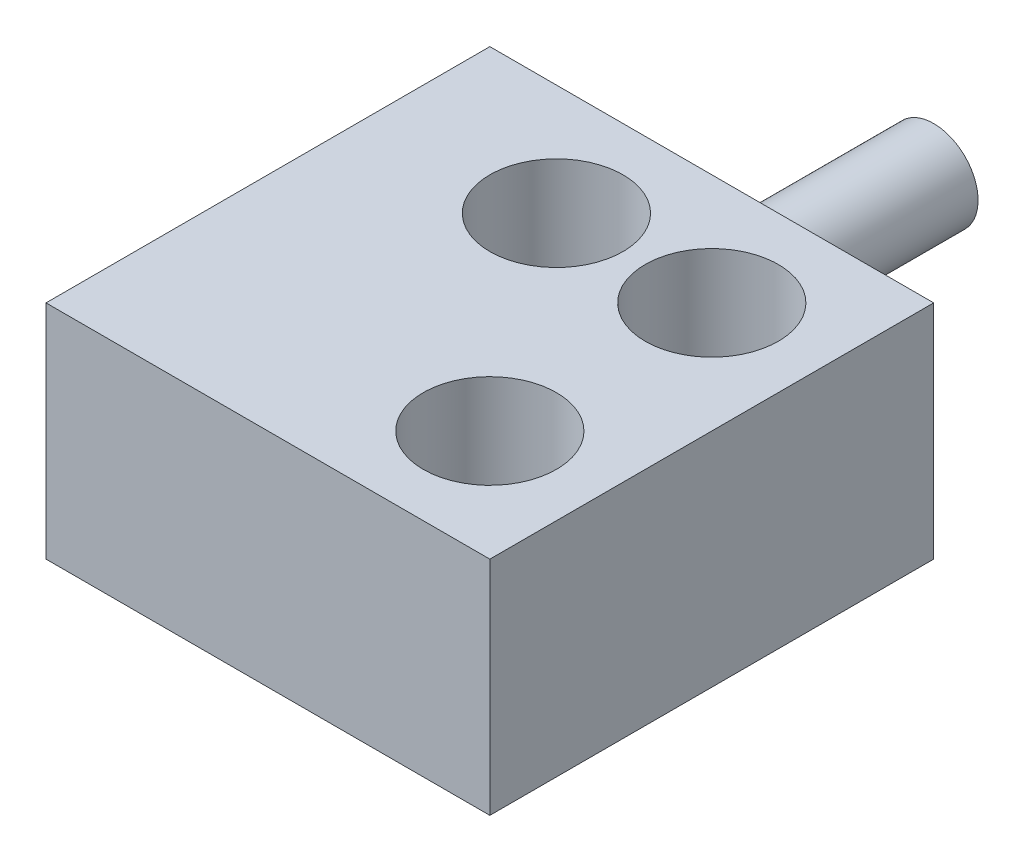
ISO-10303-21;
HEADER;
FILE_DESCRIPTION(('STEP AP214'),'2;1');
FILE_NAME('part.step','',(''),(''),'','','');
FILE_SCHEMA(('AUTOMOTIVE_DESIGN { 1 0 10303 214 1 1 1 1 }'));
ENDSEC;
DATA;
#1=APPLICATION_CONTEXT('core data for automotive mechanical design processes');
#2=APPLICATION_PROTOCOL_DEFINITION('international standard','automotive_design',2000,#1);
#3=PRODUCT_CONTEXT('',#1,'mechanical');
#4=PRODUCT('Part','Part','',(#3));
#5=PRODUCT_RELATED_PRODUCT_CATEGORY('part','',(#4));
#6=PRODUCT_DEFINITION_FORMATION('','',#4);
#7=PRODUCT_DEFINITION_CONTEXT('part definition',#1,'design');
#8=PRODUCT_DEFINITION('design','',#6,#7);
#9=PRODUCT_DEFINITION_SHAPE('','',#8);
#10=(LENGTH_UNIT() NAMED_UNIT(*) SI_UNIT(.MILLI.,.METRE.));
#11=(NAMED_UNIT(*) PLANE_ANGLE_UNIT() SI_UNIT($,.RADIAN.));
#12=(NAMED_UNIT(*) SI_UNIT($,.STERADIAN.) SOLID_ANGLE_UNIT());
#13=UNCERTAINTY_MEASURE_WITH_UNIT(LENGTH_MEASURE(1.E-05),#10,'distance_accuracy_value','');
#14=(GEOMETRIC_REPRESENTATION_CONTEXT(3) GLOBAL_UNCERTAINTY_ASSIGNED_CONTEXT((#13)) GLOBAL_UNIT_ASSIGNED_CONTEXT((#10,
#11,#12)) REPRESENTATION_CONTEXT('',''));
#15=CARTESIAN_POINT('',(0.,0.,0.));
#16=DIRECTION('',(0.,0.,1.));
#17=DIRECTION('',(1.,0.,0.));
#18=AXIS2_PLACEMENT_3D('',#15,#16,#17);
#19=CARTESIAN_POINT('',(0.,5.,0.));
#20=DIRECTION('',(0.,-1.,0.));
#21=DIRECTION('',(0.,0.,-1.));
#22=AXIS2_PLACEMENT_3D('',#19,#20,#21);
#23=PLANE('',#22);
#24=DIRECTION('',(0.,0.,1.));
#25=VECTOR('',#24,1.);
#26=CARTESIAN_POINT('',(0.,5.,0.));
#27=LINE('',#26,#25);
#28=CARTESIAN_POINT('',(0.,5.,-10.));
#29=VERTEX_POINT('',#28);
#30=CARTESIAN_POINT('',(0.,5.,0.));
#31=VERTEX_POINT('',#30);
#32=EDGE_CURVE('E96',#29,#31,#27,.T.);
#33=ORIENTED_EDGE('',*,*,#32,.T.);
#34=DIRECTION('',(1.,0.,0.));
#35=VECTOR('',#34,1.);
#36=CARTESIAN_POINT('',(0.,5.,0.));
#37=LINE('',#36,#35);
#38=CARTESIAN_POINT('',(10.,5.,0.));
#39=VERTEX_POINT('',#38);
#40=EDGE_CURVE('E91',#31,#39,#37,.T.);
#41=ORIENTED_EDGE('',*,*,#40,.T.);
#42=DIRECTION('',(0.,0.,-1.));
#43=VECTOR('',#42,1.);
#44=CARTESIAN_POINT('',(10.,5.,0.));
#45=LINE('',#44,#43);
#46=CARTESIAN_POINT('',(10.,5.,-10.));
#47=VERTEX_POINT('',#46);
#48=EDGE_CURVE('E94',#39,#47,#45,.T.);
#49=ORIENTED_EDGE('',*,*,#48,.T.);
#50=DIRECTION('',(-1.,0.,0.));
#51=VECTOR('',#50,1.);
#52=CARTESIAN_POINT('',(0.,5.,-10.));
#53=LINE('',#52,#51);
#54=EDGE_CURVE('E60',#47,#29,#53,.T.);
#55=ORIENTED_EDGE('',*,*,#54,.T.);
#56=EDGE_LOOP('',(#33,#41,#49,#55));
#57=FACE_BOUND('',#56,.T.);
#58=CARTESIAN_POINT('',(7.5,5.,-7.5));
#59=DIRECTION('',(0.,1.,0.));
#60=DIRECTION('',(0.,0.,1.));
#61=AXIS2_PLACEMENT_3D('',#58,#59,#60);
#62=CIRCLE('',#61,1.5);
#63=CARTESIAN_POINT('',(7.5,5.,-6.));
#64=VERTEX_POINT('',#63);
#65=EDGE_CURVE('E117',#64,#64,#62,.T.);
#66=ORIENTED_EDGE('',*,*,#65,.F.);
#67=EDGE_LOOP('',(#66));
#68=FACE_BOUND('',#67,.T.);
#69=CARTESIAN_POINT('',(7.5,5.,-2.5));
#70=DIRECTION('',(0.,1.,0.));
#71=DIRECTION('',(0.,0.,1.));
#72=AXIS2_PLACEMENT_3D('',#69,#70,#71);
#73=CIRCLE('',#72,1.5);
#74=CARTESIAN_POINT('',(7.5,5.,-0.999999999999999));
#75=VERTEX_POINT('',#74);
#76=EDGE_CURVE('E139',#75,#75,#73,.T.);
#77=ORIENTED_EDGE('',*,*,#76,.F.);
#78=EDGE_LOOP('',(#77));
#79=FACE_BOUND('',#78,.T.);
#80=CARTESIAN_POINT('',(4.,5.,-7.5));
#81=DIRECTION('',(0.,1.,0.));
#82=DIRECTION('',(0.,0.,1.));
#83=AXIS2_PLACEMENT_3D('',#80,#81,#82);
#84=CIRCLE('',#83,1.5);
#85=CARTESIAN_POINT('',(4.,5.,-6.));
#86=VERTEX_POINT('',#85);
#87=EDGE_CURVE('E147',#86,#86,#84,.T.);
#88=ORIENTED_EDGE('',*,*,#87,.F.);
#89=EDGE_LOOP('',(#88));
#90=FACE_BOUND('',#89,.T.);
#91=ADVANCED_FACE('F41',(#57,#68,#79,#90),#23,.F.);
#92=CARTESIAN_POINT('',(0.,0.,0.));
#93=DIRECTION('',(0.,-1.,0.));
#94=DIRECTION('',(0.,0.,-1.));
#95=AXIS2_PLACEMENT_3D('',#92,#93,#94);
#96=PLANE('',#95);
#97=CARTESIAN_POINT('',(7.5,0.,-2.5));
#98=DIRECTION('',(0.,1.,0.));
#99=DIRECTION('',(0.,0.,1.));
#100=AXIS2_PLACEMENT_3D('',#97,#98,#99);
#101=CIRCLE('',#100,1.5);
#102=CARTESIAN_POINT('',(7.5,0.,-0.999999999999999));
#103=VERTEX_POINT('',#102);
#104=EDGE_CURVE('E143',#103,#103,#101,.T.);
#105=ORIENTED_EDGE('',*,*,#104,.T.);
#106=EDGE_LOOP('',(#105));
#107=FACE_BOUND('',#106,.T.);
#108=DIRECTION('',(0.,0.,1.));
#109=VECTOR('',#108,1.);
#110=CARTESIAN_POINT('',(0.,0.,0.));
#111=LINE('',#110,#109);
#112=CARTESIAN_POINT('',(0.,0.,-10.));
#113=VERTEX_POINT('',#112);
#114=CARTESIAN_POINT('',(0.,0.,0.));
#115=VERTEX_POINT('',#114);
#116=EDGE_CURVE('E113',#113,#115,#111,.T.);
#117=ORIENTED_EDGE('',*,*,#116,.F.);
#118=DIRECTION('',(-1.,0.,0.));
#119=VECTOR('',#118,1.);
#120=CARTESIAN_POINT('',(0.,0.,-10.));
#121=LINE('',#120,#119);
#122=CARTESIAN_POINT('',(10.,0.,-10.));
#123=VERTEX_POINT('',#122);
#124=EDGE_CURVE('E83',#123,#113,#121,.T.);
#125=ORIENTED_EDGE('',*,*,#124,.F.);
#126=DIRECTION('',(0.,0.,-1.));
#127=VECTOR('',#126,1.);
#128=CARTESIAN_POINT('',(10.,0.,0.));
#129=LINE('',#128,#127);
#130=CARTESIAN_POINT('',(10.,0.,0.));
#131=VERTEX_POINT('',#130);
#132=EDGE_CURVE('E77',#131,#123,#129,.T.);
#133=ORIENTED_EDGE('',*,*,#132,.F.);
#134=DIRECTION('',(1.,0.,0.));
#135=VECTOR('',#134,1.);
#136=CARTESIAN_POINT('',(0.,0.,0.));
#137=LINE('',#136,#135);
#138=EDGE_CURVE('E102',#115,#131,#137,.T.);
#139=ORIENTED_EDGE('',*,*,#138,.F.);
#140=EDGE_LOOP('',(#117,#125,#133,#139));
#141=FACE_BOUND('',#140,.T.);
#142=CARTESIAN_POINT('',(7.5,0.,-7.5));
#143=DIRECTION('',(0.,1.,0.));
#144=DIRECTION('',(0.,0.,1.));
#145=AXIS2_PLACEMENT_3D('',#142,#143,#144);
#146=CIRCLE('',#145,1.5);
#147=CARTESIAN_POINT('',(7.5,0.,-6.));
#148=VERTEX_POINT('',#147);
#149=EDGE_CURVE('E135',#148,#148,#146,.T.);
#150=ORIENTED_EDGE('',*,*,#149,.T.);
#151=EDGE_LOOP('',(#150));
#152=FACE_BOUND('',#151,.T.);
#153=CARTESIAN_POINT('',(4.,0.,-7.5));
#154=DIRECTION('',(0.,1.,0.));
#155=DIRECTION('',(0.,0.,1.));
#156=AXIS2_PLACEMENT_3D('',#153,#154,#155);
#157=CIRCLE('',#156,1.5);
#158=CARTESIAN_POINT('',(4.,0.,-6.));
#159=VERTEX_POINT('',#158);
#160=EDGE_CURVE('E151',#159,#159,#157,.T.);
#161=ORIENTED_EDGE('',*,*,#160,.T.);
#162=EDGE_LOOP('',(#161));
#163=FACE_BOUND('',#162,.T.);
#164=ADVANCED_FACE('F130',(#107,#141,#152,#163),#96,.T.);
#165=CARTESIAN_POINT('',(0.,5.,0.));
#166=DIRECTION('',(1.,0.,0.));
#167=DIRECTION('',(0.,0.,-1.));
#168=AXIS2_PLACEMENT_3D('',#165,#166,#167);
#169=PLANE('',#168);
#170=ORIENTED_EDGE('',*,*,#116,.T.);
#171=DIRECTION('',(0.,-1.,0.));
#172=VECTOR('',#171,1.);
#173=CARTESIAN_POINT('',(0.,5.,0.));
#174=LINE('',#173,#172);
#175=EDGE_CURVE('E45',#31,#115,#174,.T.);
#176=ORIENTED_EDGE('',*,*,#175,.F.);
#177=ORIENTED_EDGE('',*,*,#32,.F.);
#178=DIRECTION('',(0.,-1.,0.));
#179=VECTOR('',#178,1.);
#180=CARTESIAN_POINT('',(0.,5.,-10.));
#181=LINE('',#180,#179);
#182=EDGE_CURVE('E109',#29,#113,#181,.T.);
#183=ORIENTED_EDGE('',*,*,#182,.T.);
#184=EDGE_LOOP('',(#170,#176,#177,#183));
#185=FACE_BOUND('',#184,.T.);
#186=ADVANCED_FACE('F43',(#185),#169,.F.);
#187=CARTESIAN_POINT('',(0.,5.,0.));
#188=DIRECTION('',(0.,0.,-1.));
#189=DIRECTION('',(-1.,0.,0.));
#190=AXIS2_PLACEMENT_3D('',#187,#188,#189);
#191=PLANE('',#190);
#192=ORIENTED_EDGE('',*,*,#138,.T.);
#193=DIRECTION('',(0.,-1.,0.));
#194=VECTOR('',#193,1.);
#195=CARTESIAN_POINT('',(10.,5.,0.));
#196=LINE('',#195,#194);
#197=EDGE_CURVE('E100',#39,#131,#196,.T.);
#198=ORIENTED_EDGE('',*,*,#197,.F.);
#199=ORIENTED_EDGE('',*,*,#40,.F.);
#200=ORIENTED_EDGE('',*,*,#175,.T.);
#201=EDGE_LOOP('',(#192,#198,#199,#200));
#202=FACE_BOUND('',#201,.T.);
#203=ADVANCED_FACE('F101',(#202),#191,.F.);
#204=CARTESIAN_POINT('',(10.,5.,0.));
#205=DIRECTION('',(-1.,0.,0.));
#206=DIRECTION('',(0.,0.,1.));
#207=AXIS2_PLACEMENT_3D('',#204,#205,#206);
#208=PLANE('',#207);
#209=ORIENTED_EDGE('',*,*,#132,.T.);
#210=DIRECTION('',(0.,-1.,0.));
#211=VECTOR('',#210,1.);
#212=CARTESIAN_POINT('',(10.,5.,-10.));
#213=LINE('',#212,#211);
#214=EDGE_CURVE('E104',#47,#123,#213,.T.);
#215=ORIENTED_EDGE('',*,*,#214,.F.);
#216=ORIENTED_EDGE('',*,*,#48,.F.);
#217=ORIENTED_EDGE('',*,*,#197,.T.);
#218=EDGE_LOOP('',(#209,#215,#216,#217));
#219=FACE_BOUND('',#218,.T.);
#220=ADVANCED_FACE('F105',(#219),#208,.F.);
#221=CARTESIAN_POINT('',(0.,5.,-10.));
#222=DIRECTION('',(0.,0.,1.));
#223=DIRECTION('',(1.,0.,0.));
#224=AXIS2_PLACEMENT_3D('',#221,#222,#223);
#225=PLANE('',#224);
#226=CARTESIAN_POINT('',(5.,2.5,-10.));
#227=DIRECTION('',(0.,0.,-1.));
#228=DIRECTION('',(-1.,0.,0.));
#229=AXIS2_PLACEMENT_3D('',#226,#227,#228);
#230=CIRCLE('',#229,1.);
#231=CARTESIAN_POINT('',(4.,2.5,-10.));
#232=VERTEX_POINT('',#231);
#233=EDGE_CURVE('E11',#232,#232,#230,.T.);
#234=ORIENTED_EDGE('',*,*,#233,.F.);
#235=EDGE_LOOP('',(#234));
#236=FACE_BOUND('',#235,.T.);
#237=ORIENTED_EDGE('',*,*,#124,.T.);
#238=ORIENTED_EDGE('',*,*,#182,.F.);
#239=ORIENTED_EDGE('',*,*,#54,.F.);
#240=ORIENTED_EDGE('',*,*,#214,.T.);
#241=EDGE_LOOP('',(#237,#238,#239,#240));
#242=FACE_BOUND('',#241,.T.);
#243=ADVANCED_FACE('F127',(#236,#242),#225,.F.);
#244=CARTESIAN_POINT('',(7.5,5.,-7.5));
#245=DIRECTION('',(0.,-1.,0.));
#246=DIRECTION('',(0.,0.,-1.));
#247=AXIS2_PLACEMENT_3D('',#244,#245,#246);
#248=CYLINDRICAL_SURFACE('',#247,1.5);
#249=ORIENTED_EDGE('',*,*,#65,.T.);
#250=EDGE_LOOP('',(#249));
#251=FACE_BOUND('',#250,.T.);
#252=ORIENTED_EDGE('',*,*,#149,.F.);
#253=EDGE_LOOP('',(#252));
#254=FACE_BOUND('',#253,.T.);
#255=ADVANCED_FACE('F173',(#251,#254),#248,.F.);
#256=CARTESIAN_POINT('',(7.5,5.,-2.5));
#257=DIRECTION('',(0.,-1.,0.));
#258=DIRECTION('',(0.,0.,-1.));
#259=AXIS2_PLACEMENT_3D('',#256,#257,#258);
#260=CYLINDRICAL_SURFACE('',#259,1.5);
#261=ORIENTED_EDGE('',*,*,#76,.T.);
#262=EDGE_LOOP('',(#261));
#263=FACE_BOUND('',#262,.T.);
#264=ORIENTED_EDGE('',*,*,#104,.F.);
#265=EDGE_LOOP('',(#264));
#266=FACE_BOUND('',#265,.T.);
#267=ADVANCED_FACE('F180',(#263,#266),#260,.F.);
#268=CARTESIAN_POINT('',(4.,5.,-7.5));
#269=DIRECTION('',(0.,-1.,0.));
#270=DIRECTION('',(0.,0.,-1.));
#271=AXIS2_PLACEMENT_3D('',#268,#269,#270);
#272=CYLINDRICAL_SURFACE('',#271,1.5);
#273=ORIENTED_EDGE('',*,*,#87,.T.);
#274=EDGE_LOOP('',(#273));
#275=FACE_BOUND('',#274,.T.);
#276=ORIENTED_EDGE('',*,*,#160,.F.);
#277=EDGE_LOOP('',(#276));
#278=FACE_BOUND('',#277,.T.);
#279=ADVANCED_FACE('F168',(#275,#278),#272,.F.);
#280=CARTESIAN_POINT('',(5.,2.5,-15.));
#281=DIRECTION('',(0.,0.,1.));
#282=DIRECTION('',(1.,0.,0.));
#283=AXIS2_PLACEMENT_3D('',#280,#281,#282);
#284=CYLINDRICAL_SURFACE('',#283,1.);
#285=CARTESIAN_POINT('',(5.,2.5,-15.));
#286=DIRECTION('',(0.,0.,-1.));
#287=DIRECTION('',(-1.,0.,0.));
#288=AXIS2_PLACEMENT_3D('',#285,#286,#287);
#289=CIRCLE('',#288,1.);
#290=CARTESIAN_POINT('',(4.,2.5,-15.));
#291=VERTEX_POINT('',#290);
#292=EDGE_CURVE('E155',#291,#291,#289,.T.);
#293=ORIENTED_EDGE('',*,*,#292,.F.);
#294=EDGE_LOOP('',(#293));
#295=FACE_BOUND('',#294,.T.);
#296=ORIENTED_EDGE('',*,*,#233,.T.);
#297=EDGE_LOOP('',(#296));
#298=FACE_BOUND('',#297,.T.);
#299=ADVANCED_FACE('F165',(#295,#298),#284,.T.);
#300=CARTESIAN_POINT('',(5.,2.5,-15.));
#301=DIRECTION('',(0.,0.,-1.));
#302=DIRECTION('',(-1.,0.,0.));
#303=AXIS2_PLACEMENT_3D('',#300,#301,#302);
#304=PLANE('',#303);
#305=ORIENTED_EDGE('',*,*,#292,.T.);
#306=EDGE_LOOP('',(#305));
#307=FACE_BOUND('',#306,.T.);
#308=ADVANCED_FACE('F163',(#307),#304,.T.);
#309=CLOSED_SHELL('',(#91,#164,#186,#203,#220,#243,#255,#267,#279,#299,#308));
#310=MANIFOLD_SOLID_BREP('B2',#309);
#311=ADVANCED_BREP_SHAPE_REPRESENTATION('',(#18,#310),#14);
#312=SHAPE_DEFINITION_REPRESENTATION(#9,#311);
ENDSEC;
END-ISO-10303-21;
